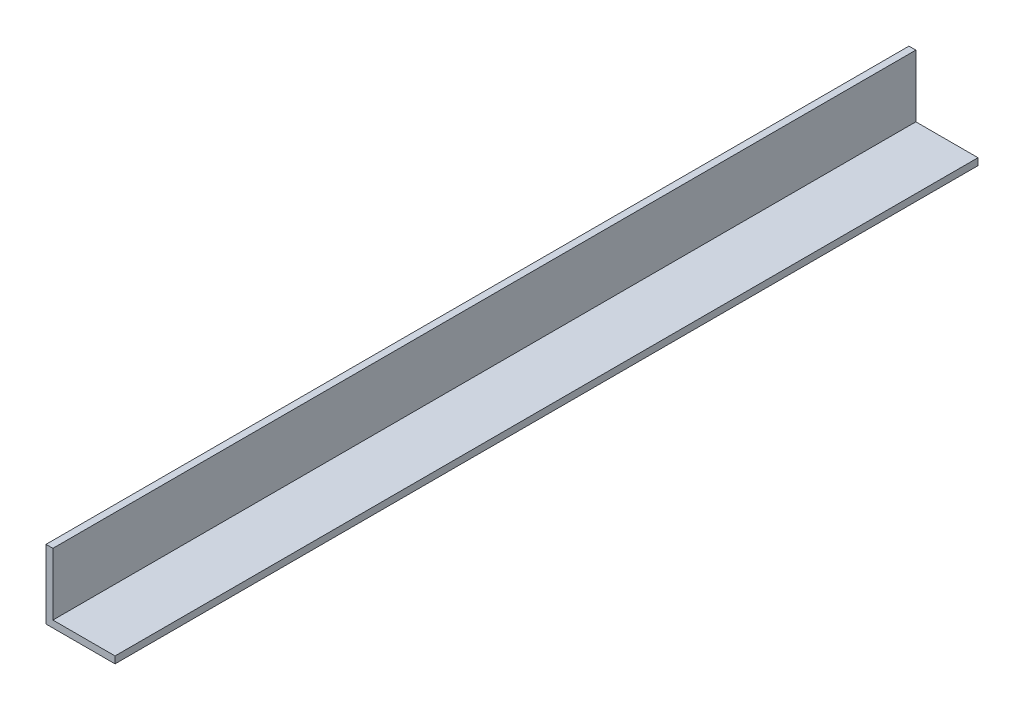
ISO-10303-21;
HEADER;
FILE_DESCRIPTION(('STEP AP214'),'2;1');
FILE_NAME('part.step','',(''),(''),'','','');
FILE_SCHEMA(('AUTOMOTIVE_DESIGN { 1 0 10303 214 1 1 1 1 }'));
ENDSEC;
DATA;
#1=APPLICATION_CONTEXT('core data for automotive mechanical design processes');
#2=APPLICATION_PROTOCOL_DEFINITION('international standard','automotive_design',2000,#1);
#3=PRODUCT_CONTEXT('',#1,'mechanical');
#4=PRODUCT('Part','Part','',(#3));
#5=PRODUCT_RELATED_PRODUCT_CATEGORY('part','',(#4));
#6=PRODUCT_DEFINITION_FORMATION('','',#4);
#7=PRODUCT_DEFINITION_CONTEXT('part definition',#1,'design');
#8=PRODUCT_DEFINITION('design','',#6,#7);
#9=PRODUCT_DEFINITION_SHAPE('','',#8);
#10=(LENGTH_UNIT() NAMED_UNIT(*) SI_UNIT(.MILLI.,.METRE.));
#11=(NAMED_UNIT(*) PLANE_ANGLE_UNIT() SI_UNIT($,.RADIAN.));
#12=(NAMED_UNIT(*) SI_UNIT($,.STERADIAN.) SOLID_ANGLE_UNIT());
#13=UNCERTAINTY_MEASURE_WITH_UNIT(LENGTH_MEASURE(1.E-05),#10,'distance_accuracy_value','');
#14=(GEOMETRIC_REPRESENTATION_CONTEXT(3) GLOBAL_UNCERTAINTY_ASSIGNED_CONTEXT((#13)) GLOBAL_UNIT_ASSIGNED_CONTEXT((#10,
#11,#12)) REPRESENTATION_CONTEXT('',''));
#15=CARTESIAN_POINT('',(0.,0.,0.));
#16=DIRECTION('',(0.,0.,1.));
#17=DIRECTION('',(1.,0.,0.));
#18=AXIS2_PLACEMENT_3D('',#15,#16,#17);
#19=CARTESIAN_POINT('',(40.,0.,500.));
#20=DIRECTION('',(0.,1.,0.));
#21=DIRECTION('',(-1.,0.,0.));
#22=AXIS2_PLACEMENT_3D('',#19,#20,#21);
#23=PLANE('',#22);
#24=DIRECTION('',(1.,0.,0.));
#25=VECTOR('',#24,1.);
#26=CARTESIAN_POINT('',(40.,0.,0.));
#27=LINE('',#26,#25);
#28=CARTESIAN_POINT('',(0.,0.,0.));
#29=VERTEX_POINT('',#28);
#30=CARTESIAN_POINT('',(40.,0.,0.));
#31=VERTEX_POINT('',#30);
#32=EDGE_CURVE('E128',#29,#31,#27,.T.);
#33=ORIENTED_EDGE('',*,*,#32,.T.);
#34=DIRECTION('',(0.,0.,-1.));
#35=VECTOR('',#34,1.);
#36=CARTESIAN_POINT('',(40.,0.,500.));
#37=LINE('',#36,#35);
#38=CARTESIAN_POINT('',(40.,0.,500.));
#39=VERTEX_POINT('',#38);
#40=EDGE_CURVE('E11',#39,#31,#37,.T.);
#41=ORIENTED_EDGE('',*,*,#40,.F.);
#42=DIRECTION('',(1.,0.,0.));
#43=VECTOR('',#42,1.);
#44=CARTESIAN_POINT('',(40.,0.,500.));
#45=LINE('',#44,#43);
#46=CARTESIAN_POINT('',(0.,0.,500.));
#47=VERTEX_POINT('',#46);
#48=EDGE_CURVE('E144',#47,#39,#45,.T.);
#49=ORIENTED_EDGE('',*,*,#48,.F.);
#50=DIRECTION('',(0.,0.,-1.));
#51=VECTOR('',#50,1.);
#52=CARTESIAN_POINT('',(0.,0.,500.));
#53=LINE('',#52,#51);
#54=EDGE_CURVE('E124',#47,#29,#53,.T.);
#55=ORIENTED_EDGE('',*,*,#54,.T.);
#56=EDGE_LOOP('',(#33,#41,#49,#55));
#57=FACE_BOUND('',#56,.T.);
#58=ADVANCED_FACE('F39',(#57),#23,.F.);
#59=CARTESIAN_POINT('',(40.,4.,500.));
#60=DIRECTION('',(-1.,0.,0.));
#61=DIRECTION('',(0.,0.,1.));
#62=AXIS2_PLACEMENT_3D('',#59,#60,#61);
#63=PLANE('',#62);
#64=DIRECTION('',(0.,1.,0.));
#65=VECTOR('',#64,1.);
#66=CARTESIAN_POINT('',(40.,4.,0.));
#67=LINE('',#66,#65);
#68=CARTESIAN_POINT('',(40.,4.,0.));
#69=VERTEX_POINT('',#68);
#70=EDGE_CURVE('E132',#31,#69,#67,.T.);
#71=ORIENTED_EDGE('',*,*,#70,.T.);
#72=DIRECTION('',(0.,0.,-1.));
#73=VECTOR('',#72,1.);
#74=CARTESIAN_POINT('',(40.,4.,500.));
#75=LINE('',#74,#73);
#76=CARTESIAN_POINT('',(40.,4.,500.));
#77=VERTEX_POINT('',#76);
#78=EDGE_CURVE('E48',#77,#69,#75,.T.);
#79=ORIENTED_EDGE('',*,*,#78,.F.);
#80=DIRECTION('',(0.,1.,0.));
#81=VECTOR('',#80,1.);
#82=CARTESIAN_POINT('',(40.,4.,500.));
#83=LINE('',#82,#81);
#84=EDGE_CURVE('E93',#39,#77,#83,.T.);
#85=ORIENTED_EDGE('',*,*,#84,.F.);
#86=ORIENTED_EDGE('',*,*,#40,.T.);
#87=EDGE_LOOP('',(#71,#79,#85,#86));
#88=FACE_BOUND('',#87,.T.);
#89=ADVANCED_FACE('F172',(#88),#63,.F.);
#90=CARTESIAN_POINT('',(4.,4.,500.));
#91=DIRECTION('',(0.,-1.,0.));
#92=DIRECTION('',(0.,0.,-1.));
#93=AXIS2_PLACEMENT_3D('',#90,#91,#92);
#94=PLANE('',#93);
#95=DIRECTION('',(-1.,0.,0.));
#96=VECTOR('',#95,1.);
#97=CARTESIAN_POINT('',(4.,4.,0.));
#98=LINE('',#97,#96);
#99=CARTESIAN_POINT('',(4.,4.,0.));
#100=VERTEX_POINT('',#99);
#101=EDGE_CURVE('E135',#69,#100,#98,.T.);
#102=ORIENTED_EDGE('',*,*,#101,.T.);
#103=DIRECTION('',(0.,0.,-1.));
#104=VECTOR('',#103,1.);
#105=CARTESIAN_POINT('',(4.,4.,500.));
#106=LINE('',#105,#104);
#107=CARTESIAN_POINT('',(4.,4.,500.));
#108=VERTEX_POINT('',#107);
#109=EDGE_CURVE('E117',#108,#100,#106,.T.);
#110=ORIENTED_EDGE('',*,*,#109,.F.);
#111=DIRECTION('',(-1.,0.,0.));
#112=VECTOR('',#111,1.);
#113=CARTESIAN_POINT('',(4.,4.,500.));
#114=LINE('',#113,#112);
#115=EDGE_CURVE('E106',#77,#108,#114,.T.);
#116=ORIENTED_EDGE('',*,*,#115,.F.);
#117=ORIENTED_EDGE('',*,*,#78,.T.);
#118=EDGE_LOOP('',(#102,#110,#116,#117));
#119=FACE_BOUND('',#118,.T.);
#120=ADVANCED_FACE('F154',(#119),#94,.F.);
#121=CARTESIAN_POINT('',(4.,40.,500.));
#122=DIRECTION('',(-1.,0.,0.));
#123=DIRECTION('',(0.,-1.,0.));
#124=AXIS2_PLACEMENT_3D('',#121,#122,#123);
#125=PLANE('',#124);
#126=DIRECTION('',(0.,1.,0.));
#127=VECTOR('',#126,1.);
#128=CARTESIAN_POINT('',(4.,40.,0.));
#129=LINE('',#128,#127);
#130=CARTESIAN_POINT('',(4.,40.,0.));
#131=VERTEX_POINT('',#130);
#132=EDGE_CURVE('E115',#100,#131,#129,.T.);
#133=ORIENTED_EDGE('',*,*,#132,.T.);
#134=DIRECTION('',(0.,0.,-1.));
#135=VECTOR('',#134,1.);
#136=CARTESIAN_POINT('',(4.,40.,500.));
#137=LINE('',#136,#135);
#138=CARTESIAN_POINT('',(4.,40.,500.));
#139=VERTEX_POINT('',#138);
#140=EDGE_CURVE('E112',#139,#131,#137,.T.);
#141=ORIENTED_EDGE('',*,*,#140,.F.);
#142=DIRECTION('',(0.,1.,0.));
#143=VECTOR('',#142,1.);
#144=CARTESIAN_POINT('',(4.,40.,500.));
#145=LINE('',#144,#143);
#146=EDGE_CURVE('E100',#108,#139,#145,.T.);
#147=ORIENTED_EDGE('',*,*,#146,.F.);
#148=ORIENTED_EDGE('',*,*,#109,.T.);
#149=EDGE_LOOP('',(#133,#141,#147,#148));
#150=FACE_BOUND('',#149,.T.);
#151=ADVANCED_FACE('F113',(#150),#125,.F.);
#152=CARTESIAN_POINT('',(0.,40.,500.));
#153=DIRECTION('',(0.,-1.,0.));
#154=DIRECTION('',(0.,0.,-1.));
#155=AXIS2_PLACEMENT_3D('',#152,#153,#154);
#156=PLANE('',#155);
#157=DIRECTION('',(-1.,0.,0.));
#158=VECTOR('',#157,1.);
#159=CARTESIAN_POINT('',(0.,40.,0.));
#160=LINE('',#159,#158);
#161=CARTESIAN_POINT('',(0.,40.,0.));
#162=VERTEX_POINT('',#161);
#163=EDGE_CURVE('E79',#131,#162,#160,.T.);
#164=ORIENTED_EDGE('',*,*,#163,.T.);
#165=DIRECTION('',(0.,0.,-1.));
#166=VECTOR('',#165,1.);
#167=CARTESIAN_POINT('',(0.,40.,500.));
#168=LINE('',#167,#166);
#169=CARTESIAN_POINT('',(0.,40.,500.));
#170=VERTEX_POINT('',#169);
#171=EDGE_CURVE('E118',#170,#162,#168,.T.);
#172=ORIENTED_EDGE('',*,*,#171,.F.);
#173=DIRECTION('',(-1.,0.,0.));
#174=VECTOR('',#173,1.);
#175=CARTESIAN_POINT('',(0.,40.,500.));
#176=LINE('',#175,#174);
#177=EDGE_CURVE('E104',#139,#170,#176,.T.);
#178=ORIENTED_EDGE('',*,*,#177,.F.);
#179=ORIENTED_EDGE('',*,*,#140,.T.);
#180=EDGE_LOOP('',(#164,#172,#178,#179));
#181=FACE_BOUND('',#180,.T.);
#182=ADVANCED_FACE('F120',(#181),#156,.F.);
#183=CARTESIAN_POINT('',(0.,0.,500.));
#184=DIRECTION('',(1.,0.,0.));
#185=DIRECTION('',(0.,0.,-1.));
#186=AXIS2_PLACEMENT_3D('',#183,#184,#185);
#187=PLANE('',#186);
#188=DIRECTION('',(0.,-1.,0.));
#189=VECTOR('',#188,1.);
#190=CARTESIAN_POINT('',(0.,0.,0.));
#191=LINE('',#190,#189);
#192=EDGE_CURVE('E85',#162,#29,#191,.T.);
#193=ORIENTED_EDGE('',*,*,#192,.T.);
#194=ORIENTED_EDGE('',*,*,#54,.F.);
#195=DIRECTION('',(0.,-1.,0.));
#196=VECTOR('',#195,1.);
#197=CARTESIAN_POINT('',(0.,0.,500.));
#198=LINE('',#197,#196);
#199=EDGE_CURVE('E56',#170,#47,#198,.T.);
#200=ORIENTED_EDGE('',*,*,#199,.F.);
#201=ORIENTED_EDGE('',*,*,#171,.T.);
#202=EDGE_LOOP('',(#193,#194,#200,#201));
#203=FACE_BOUND('',#202,.T.);
#204=ADVANCED_FACE('F161',(#203),#187,.F.);
#205=CARTESIAN_POINT('',(0.,0.,500.));
#206=DIRECTION('',(0.,0.,-1.));
#207=DIRECTION('',(-1.,0.,0.));
#208=AXIS2_PLACEMENT_3D('',#205,#206,#207);
#209=PLANE('',#208);
#210=ORIENTED_EDGE('',*,*,#48,.T.);
#211=ORIENTED_EDGE('',*,*,#84,.T.);
#212=ORIENTED_EDGE('',*,*,#115,.T.);
#213=ORIENTED_EDGE('',*,*,#146,.T.);
#214=ORIENTED_EDGE('',*,*,#177,.T.);
#215=ORIENTED_EDGE('',*,*,#199,.T.);
#216=EDGE_LOOP('',(#210,#211,#212,#213,#214,#215));
#217=FACE_BOUND('',#216,.T.);
#218=ADVANCED_FACE('F102',(#217),#209,.F.);
#219=CARTESIAN_POINT('',(0.,0.,0.));
#220=DIRECTION('',(0.,0.,-1.));
#221=DIRECTION('',(-1.,0.,0.));
#222=AXIS2_PLACEMENT_3D('',#219,#220,#221);
#223=PLANE('',#222);
#224=ORIENTED_EDGE('',*,*,#32,.F.);
#225=ORIENTED_EDGE('',*,*,#192,.F.);
#226=ORIENTED_EDGE('',*,*,#163,.F.);
#227=ORIENTED_EDGE('',*,*,#132,.F.);
#228=ORIENTED_EDGE('',*,*,#101,.F.);
#229=ORIENTED_EDGE('',*,*,#70,.F.);
#230=EDGE_LOOP('',(#224,#225,#226,#227,#228,#229));
#231=FACE_BOUND('',#230,.T.);
#232=ADVANCED_FACE('F157',(#231),#223,.T.);
#233=CLOSED_SHELL('',(#58,#89,#120,#151,#182,#204,#218,#232));
#234=MANIFOLD_SOLID_BREP('B2',#233);
#235=ADVANCED_BREP_SHAPE_REPRESENTATION('',(#18,#234),#14);
#236=SHAPE_DEFINITION_REPRESENTATION(#9,#235);
ENDSEC;
END-ISO-10303-21;
